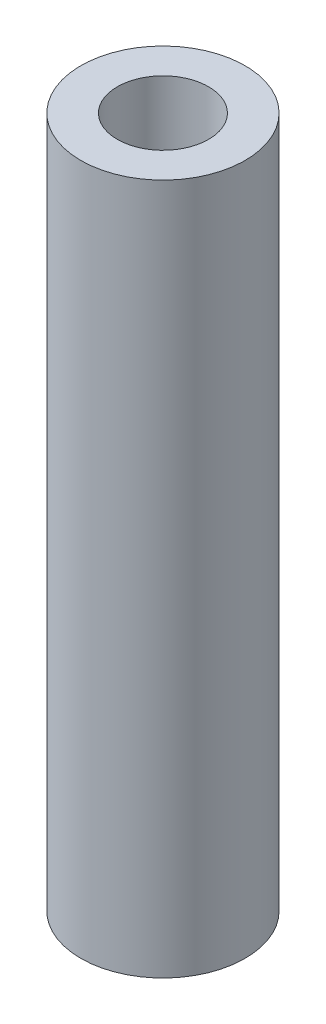
ISO-10303-21;
HEADER;
FILE_DESCRIPTION(('STEP AP214'),'2;1');
FILE_NAME('part.step','',(''),(''),'','','');
FILE_SCHEMA(('AUTOMOTIVE_DESIGN { 1 0 10303 214 1 1 1 1 }'));
ENDSEC;
DATA;
#1=APPLICATION_CONTEXT('core data for automotive mechanical design processes');
#2=APPLICATION_PROTOCOL_DEFINITION('international standard','automotive_design',2000,#1);
#3=PRODUCT_CONTEXT('',#1,'mechanical');
#4=PRODUCT('Part','Part','',(#3));
#5=PRODUCT_RELATED_PRODUCT_CATEGORY('part','',(#4));
#6=PRODUCT_DEFINITION_FORMATION('','',#4);
#7=PRODUCT_DEFINITION_CONTEXT('part definition',#1,'design');
#8=PRODUCT_DEFINITION('design','',#6,#7);
#9=PRODUCT_DEFINITION_SHAPE('','',#8);
#10=(LENGTH_UNIT() NAMED_UNIT(*) SI_UNIT(.MILLI.,.METRE.));
#11=(NAMED_UNIT(*) PLANE_ANGLE_UNIT() SI_UNIT($,.RADIAN.));
#12=(NAMED_UNIT(*) SI_UNIT($,.STERADIAN.) SOLID_ANGLE_UNIT());
#13=UNCERTAINTY_MEASURE_WITH_UNIT(LENGTH_MEASURE(1.E-05),#10,'distance_accuracy_value','');
#14=(GEOMETRIC_REPRESENTATION_CONTEXT(3) GLOBAL_UNCERTAINTY_ASSIGNED_CONTEXT((#13)) GLOBAL_UNIT_ASSIGNED_CONTEXT((#10,
#11,#12)) REPRESENTATION_CONTEXT('',''));
#15=CARTESIAN_POINT('',(0.,0.,0.));
#16=DIRECTION('',(0.,0.,1.));
#17=DIRECTION('',(1.,0.,0.));
#18=AXIS2_PLACEMENT_3D('',#15,#16,#17);
#19=CARTESIAN_POINT('',(0.,344.744344028702,0.));
#20=DIRECTION('',(0.,1.,0.));
#21=DIRECTION('',(0.,0.,1.));
#22=AXIS2_PLACEMENT_3D('',#19,#20,#21);
#23=CYLINDRICAL_SURFACE('',#22,35.);
#24=CARTESIAN_POINT('',(0.,-265.,0.));
#25=DIRECTION('',(0.,1.,0.));
#26=DIRECTION('',(0.,0.,1.));
#27=AXIS2_PLACEMENT_3D('',#24,#25,#26);
#28=CIRCLE('',#27,35.);
#29=CARTESIAN_POINT('',(0.,-265.,35.));
#30=VERTEX_POINT('',#29);
#31=EDGE_CURVE('E10',#30,#30,#28,.T.);
#32=ORIENTED_EDGE('',*,*,#31,.F.);
#33=EDGE_LOOP('',(#32));
#34=FACE_BOUND('',#33,.T.);
#35=CARTESIAN_POINT('',(0.,265.,0.));
#36=DIRECTION('',(0.,1.,0.));
#37=DIRECTION('',(0.,0.,1.));
#38=AXIS2_PLACEMENT_3D('',#35,#36,#37);
#39=CIRCLE('',#38,35.);
#40=CARTESIAN_POINT('',(0.,265.,35.));
#41=VERTEX_POINT('',#40);
#42=EDGE_CURVE('E59',#41,#41,#39,.T.);
#43=ORIENTED_EDGE('',*,*,#42,.T.);
#44=EDGE_LOOP('',(#43));
#45=FACE_BOUND('',#44,.T.);
#46=ADVANCED_FACE('F42',(#34,#45),#23,.F.);
#47=CARTESIAN_POINT('',(35.,-265.,0.));
#48=DIRECTION('',(0.,1.,0.));
#49=DIRECTION('',(0.,0.,1.));
#50=AXIS2_PLACEMENT_3D('',#47,#48,#49);
#51=PLANE('',#50);
#52=CARTESIAN_POINT('',(0.,-265.,0.));
#53=DIRECTION('',(0.,1.,0.));
#54=DIRECTION('',(0.,0.,1.));
#55=AXIS2_PLACEMENT_3D('',#52,#53,#54);
#56=CIRCLE('',#55,63.);
#57=CARTESIAN_POINT('',(0.,-265.,63.));
#58=VERTEX_POINT('',#57);
#59=EDGE_CURVE('E49',#58,#58,#56,.T.);
#60=ORIENTED_EDGE('',*,*,#59,.F.);
#61=EDGE_LOOP('',(#60));
#62=FACE_BOUND('',#61,.T.);
#63=ORIENTED_EDGE('',*,*,#31,.T.);
#64=EDGE_LOOP('',(#63));
#65=FACE_BOUND('',#64,.T.);
#66=ADVANCED_FACE('F75',(#62,#65),#51,.F.);
#67=CARTESIAN_POINT('',(0.,344.744344028702,0.));
#68=DIRECTION('',(0.,1.,0.));
#69=DIRECTION('',(0.,0.,1.));
#70=AXIS2_PLACEMENT_3D('',#67,#68,#69);
#71=CYLINDRICAL_SURFACE('',#70,63.);
#72=CARTESIAN_POINT('',(0.,265.,0.));
#73=DIRECTION('',(0.,1.,0.));
#74=DIRECTION('',(0.,0.,1.));
#75=AXIS2_PLACEMENT_3D('',#72,#73,#74);
#76=CIRCLE('',#75,63.);
#77=CARTESIAN_POINT('',(0.,265.,63.));
#78=VERTEX_POINT('',#77);
#79=EDGE_CURVE('E54',#78,#78,#76,.T.);
#80=ORIENTED_EDGE('',*,*,#79,.F.);
#81=EDGE_LOOP('',(#80));
#82=FACE_BOUND('',#81,.T.);
#83=ORIENTED_EDGE('',*,*,#59,.T.);
#84=EDGE_LOOP('',(#83));
#85=FACE_BOUND('',#84,.T.);
#86=ADVANCED_FACE('F70',(#82,#85),#71,.T.);
#87=CARTESIAN_POINT('',(35.,265.,0.));
#88=DIRECTION('',(0.,-1.,0.));
#89=DIRECTION('',(0.,0.,-1.));
#90=AXIS2_PLACEMENT_3D('',#87,#88,#89);
#91=PLANE('',#90);
#92=ORIENTED_EDGE('',*,*,#42,.F.);
#93=EDGE_LOOP('',(#92));
#94=FACE_BOUND('',#93,.T.);
#95=ORIENTED_EDGE('',*,*,#79,.T.);
#96=EDGE_LOOP('',(#95));
#97=FACE_BOUND('',#96,.T.);
#98=ADVANCED_FACE('F67',(#94,#97),#91,.F.);
#99=CLOSED_SHELL('',(#46,#66,#86,#98));
#100=MANIFOLD_SOLID_BREP('B2',#99);
#101=ADVANCED_BREP_SHAPE_REPRESENTATION('',(#18,#100),#14);
#102=SHAPE_DEFINITION_REPRESENTATION(#9,#101);
ENDSEC;
END-ISO-10303-21;
